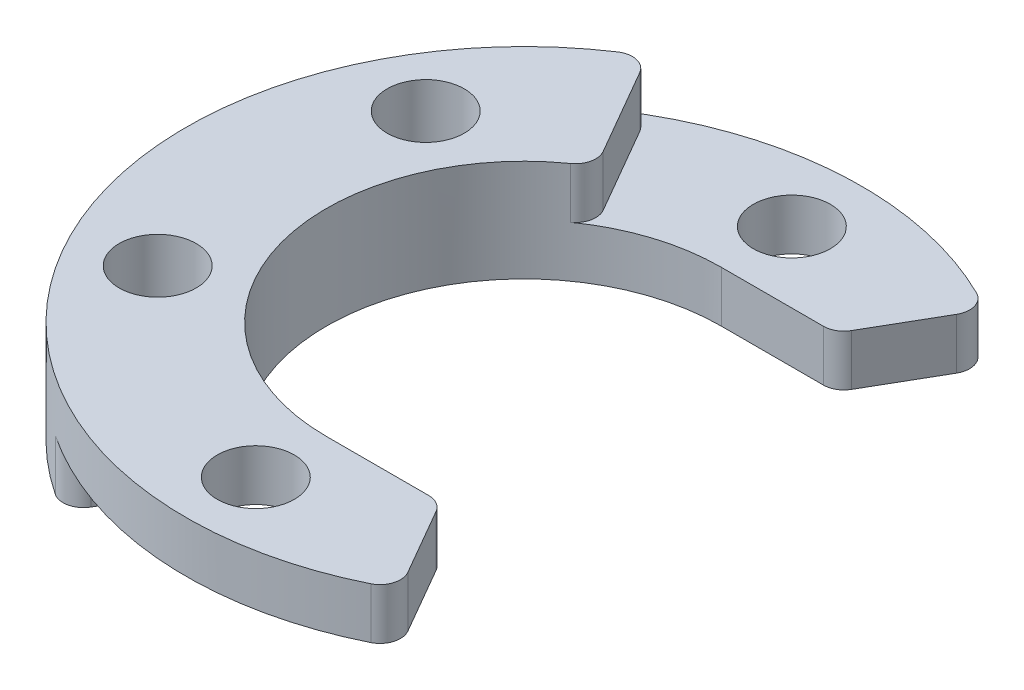
ISO-10303-21;
HEADER;
FILE_DESCRIPTION(('STEP AP214'),'2;1');
FILE_NAME('part.step','',(''),(''),'','','');
FILE_SCHEMA(('AUTOMOTIVE_DESIGN { 1 0 10303 214 1 1 1 1 }'));
ENDSEC;
DATA;
#1=APPLICATION_CONTEXT('core data for automotive mechanical design processes');
#2=APPLICATION_PROTOCOL_DEFINITION('international standard','automotive_design',2000,#1);
#3=PRODUCT_CONTEXT('',#1,'mechanical');
#4=PRODUCT('Part','Part','',(#3));
#5=PRODUCT_RELATED_PRODUCT_CATEGORY('part','',(#4));
#6=PRODUCT_DEFINITION_FORMATION('','',#4);
#7=PRODUCT_DEFINITION_CONTEXT('part definition',#1,'design');
#8=PRODUCT_DEFINITION('design','',#6,#7);
#9=PRODUCT_DEFINITION_SHAPE('','',#8);
#10=(LENGTH_UNIT() NAMED_UNIT(*) SI_UNIT(.MILLI.,.METRE.));
#11=(NAMED_UNIT(*) PLANE_ANGLE_UNIT() SI_UNIT($,.RADIAN.));
#12=(NAMED_UNIT(*) SI_UNIT($,.STERADIAN.) SOLID_ANGLE_UNIT());
#13=UNCERTAINTY_MEASURE_WITH_UNIT(LENGTH_MEASURE(1.E-05),#10,'distance_accuracy_value','');
#14=(GEOMETRIC_REPRESENTATION_CONTEXT(3) GLOBAL_UNCERTAINTY_ASSIGNED_CONTEXT((#13)) GLOBAL_UNIT_ASSIGNED_CONTEXT((#10,
#11,#12)) REPRESENTATION_CONTEXT('',''));
#15=CARTESIAN_POINT('',(0.,0.,0.));
#16=DIRECTION('',(0.,0.,1.));
#17=DIRECTION('',(1.,0.,0.));
#18=AXIS2_PLACEMENT_3D('',#15,#16,#17);
#19=CARTESIAN_POINT('',(0.,12.7,0.));
#20=DIRECTION('',(0.,-1.,0.));
#21=DIRECTION('',(0.,0.,-1.));
#22=AXIS2_PLACEMENT_3D('',#19,#20,#21);
#23=CYLINDRICAL_SURFACE('',#22,24.5992194732583);
#24=CARTESIAN_POINT('',(0.,6.35,0.));
#25=DIRECTION('',(0.,-1.,0.));
#26=DIRECTION('',(0.,0.,-1.));
#27=AXIS2_PLACEMENT_3D('',#24,#25,#26);
#28=CIRCLE('',#27,24.5992194732583);
#29=CARTESIAN_POINT('',(-14.2394537560617,6.35,-20.0589021489839));
#30=VERTEX_POINT('',#29);
#31=CARTESIAN_POINT('',(0.,6.35,-24.5992194732583));
#32=VERTEX_POINT('',#31);
#33=EDGE_CURVE('E204',#30,#32,#28,.T.);
#34=ORIENTED_EDGE('',*,*,#33,.F.);
#35=DIRECTION('',(0.,-1.,0.));
#36=VECTOR('',#35,1.);
#37=CARTESIAN_POINT('',(-14.2394537560617,12.7,-20.0589021489839));
#38=LINE('',#37,#36);
#39=CARTESIAN_POINT('',(-14.2394537560617,12.7,-20.0589021489839));
#40=VERTEX_POINT('',#39);
#41=EDGE_CURVE('E162',#30,#40,#38,.F.);
#42=ORIENTED_EDGE('',*,*,#41,.T.);
#43=CARTESIAN_POINT('',(0.,12.7,0.));
#44=DIRECTION('',(0.,1.,0.));
#45=DIRECTION('',(0.,0.,1.));
#46=AXIS2_PLACEMENT_3D('',#43,#44,#45);
#47=CIRCLE('',#46,24.5992194732583);
#48=CARTESIAN_POINT('',(0.,12.7,24.5992194732583));
#49=VERTEX_POINT('',#48);
#50=EDGE_CURVE('E156',#40,#49,#47,.T.);
#51=ORIENTED_EDGE('',*,*,#50,.T.);
#52=DIRECTION('',(0.,-1.,0.));
#53=VECTOR('',#52,1.);
#54=CARTESIAN_POINT('',(0.,12.7,24.5992194732583));
#55=LINE('',#54,#53);
#56=CARTESIAN_POINT('',(0.,6.35,24.5992194732583));
#57=VERTEX_POINT('',#56);
#58=EDGE_CURVE('E159',#49,#57,#55,.T.);
#59=ORIENTED_EDGE('',*,*,#58,.T.);
#60=CARTESIAN_POINT('',(0.,6.35,0.));
#61=DIRECTION('',(0.,1.,0.));
#62=DIRECTION('',(0.,0.,1.));
#63=AXIS2_PLACEMENT_3D('',#60,#61,#62);
#64=CIRCLE('',#63,24.5992194732583);
#65=CARTESIAN_POINT('',(-14.2394537560617,6.35,20.0589021489839));
#66=VERTEX_POINT('',#65);
#67=EDGE_CURVE('E191',#66,#57,#64,.T.);
#68=ORIENTED_EDGE('',*,*,#67,.F.);
#69=DIRECTION('',(0.,-1.,0.));
#70=VECTOR('',#69,1.);
#71=CARTESIAN_POINT('',(-14.2394537560617,12.7,20.0589021489839));
#72=LINE('',#71,#70);
#73=CARTESIAN_POINT('',(-14.2394537560617,0.,20.0589021489839));
#74=VERTEX_POINT('',#73);
#75=EDGE_CURVE('E305',#66,#74,#72,.T.);
#76=ORIENTED_EDGE('',*,*,#75,.T.);
#77=CARTESIAN_POINT('',(0.,0.,0.));
#78=DIRECTION('',(0.,1.,0.));
#79=DIRECTION('',(0.,0.,1.));
#80=AXIS2_PLACEMENT_3D('',#77,#78,#79);
#81=CIRCLE('',#80,24.5992194732583);
#82=CARTESIAN_POINT('',(0.,0.,-24.5992194732583));
#83=VERTEX_POINT('',#82);
#84=EDGE_CURVE('E166',#83,#74,#81,.T.);
#85=ORIENTED_EDGE('',*,*,#84,.F.);
#86=DIRECTION('',(0.,-1.,0.));
#87=VECTOR('',#86,1.);
#88=CARTESIAN_POINT('',(0.,12.7,-24.5992194732583));
#89=LINE('',#88,#87);
#90=EDGE_CURVE('E177',#32,#83,#89,.T.);
#91=ORIENTED_EDGE('',*,*,#90,.F.);
#92=EDGE_LOOP('',(#34,#42,#51,#59,#68,#76,#85,#91));
#93=FACE_BOUND('',#92,.T.);
#94=ADVANCED_FACE('F31',(#93),#23,.F.);
#95=CARTESIAN_POINT('',(0.,12.7,0.));
#96=DIRECTION('',(0.,1.,0.));
#97=DIRECTION('',(0.,0.,1.));
#98=AXIS2_PLACEMENT_3D('',#95,#96,#97);
#99=PLANE('',#98);
#100=DIRECTION('',(0.5,0.,0.866025403784439));
#101=VECTOR('',#100,1.);
#102=CARTESIAN_POINT('',(0.,12.7,0.));
#103=LINE('',#102,#101);
#104=CARTESIAN_POINT('',(-19.7374369319673,12.7,-34.1862435773538));
#105=VERTEX_POINT('',#104);
#106=CARTESIAN_POINT('',(-13.5100484234669,12.7,-23.4000902821605));
#107=VERTEX_POINT('',#106);
#108=EDGE_CURVE('E200',#105,#107,#103,.T.);
#109=ORIENTED_EDGE('',*,*,#108,.F.);
#110=CARTESIAN_POINT('',(-21.9371414575798,12.7,-32.9162435773538));
#111=DIRECTION('',(0.,1.,0.));
#112=DIRECTION('',(0.,0.,1.));
#113=AXIS2_PLACEMENT_3D('',#110,#111,#112);
#114=CIRCLE('',#113,2.54);
#115=CARTESIAN_POINT('',(-23.3457678293843,12.7,-35.0298593760876));
#116=VERTEX_POINT('',#115);
#117=EDGE_CURVE('E303',#105,#116,#114,.T.);
#118=ORIENTED_EDGE('',*,*,#117,.T.);
#119=CARTESIAN_POINT('',(0.,12.7,0.));
#120=DIRECTION('',(0.,1.,0.));
#121=DIRECTION('',(0.,0.,1.));
#122=AXIS2_PLACEMENT_3D('',#119,#120,#121);
#123=CIRCLE('',#122,42.0965072595339);
#124=CARTESIAN_POINT('',(18.6638641959963,12.7,37.732957699144));
#125=VERTEX_POINT('',#124);
#126=EDGE_CURVE('E241',#116,#125,#123,.T.);
#127=ORIENTED_EDGE('',*,*,#126,.T.);
#128=CARTESIAN_POINT('',(17.5377324063549,12.7,35.4562435773538));
#129=DIRECTION('',(0.,1.,0.));
#130=DIRECTION('',(0.,0.,1.));
#131=AXIS2_PLACEMENT_3D('',#128,#129,#130);
#132=CIRCLE('',#131,2.54);
#133=CARTESIAN_POINT('',(19.7374369319674,12.7,34.1862435773538));
#134=VERTEX_POINT('',#133);
#135=EDGE_CURVE('E281',#125,#134,#132,.T.);
#136=ORIENTED_EDGE('',*,*,#135,.T.);
#137=DIRECTION('',(0.500000000000001,0.,0.866025403784438));
#138=VECTOR('',#137,1.);
#139=CARTESIAN_POINT('',(29.4022070003563,12.7,50.9261163792742));
#140=LINE('',#139,#138);
#141=CARTESIAN_POINT('',(14.9356008266113,12.7,25.8692194732583));
#142=VERTEX_POINT('',#141);
#143=EDGE_CURVE('E215',#142,#134,#140,.T.);
#144=ORIENTED_EDGE('',*,*,#143,.F.);
#145=CARTESIAN_POINT('',(12.7358963009988,12.7,27.1392194732583));
#146=DIRECTION('',(0.,1.,0.));
#147=DIRECTION('',(0.,0.,1.));
#148=AXIS2_PLACEMENT_3D('',#145,#146,#147);
#149=CIRCLE('',#148,2.54);
#150=CARTESIAN_POINT('',(12.7358963009988,12.7,24.5992194732583));
#151=VERTEX_POINT('',#150);
#152=EDGE_CURVE('E174',#142,#151,#149,.T.);
#153=ORIENTED_EDGE('',*,*,#152,.T.);
#154=DIRECTION('',(-1.,0.,0.));
#155=VECTOR('',#154,1.);
#156=CARTESIAN_POINT('',(0.,12.7,24.5992194732583));
#157=LINE('',#156,#155);
#158=EDGE_CURVE('E169',#151,#49,#157,.T.);
#159=ORIENTED_EDGE('',*,*,#158,.T.);
#160=ORIENTED_EDGE('',*,*,#50,.F.);
#161=CARTESIAN_POINT('',(-15.7097529490794,12.7,-22.1300902821605));
#162=DIRECTION('',(0.,1.,0.));
#163=DIRECTION('',(0.,0.,1.));
#164=AXIS2_PLACEMENT_3D('',#161,#162,#163);
#165=CIRCLE('',#164,2.54);
#166=EDGE_CURVE('E301',#40,#107,#165,.T.);
#167=ORIENTED_EDGE('',*,*,#166,.T.);
#168=EDGE_LOOP('',(#109,#118,#127,#136,#144,#153,#159,#160,#167));
#169=FACE_BOUND('',#168,.T.);
#170=CARTESIAN_POINT('',(-28.9192671825416,12.7,16.6965466926067));
#171=DIRECTION('',(0.,1.,0.));
#172=DIRECTION('',(0.,0.,1.));
#173=AXIS2_PLACEMENT_3D('',#170,#171,#172);
#174=CIRCLE('',#173,4.80130432203246);
#175=CARTESIAN_POINT('',(-28.9192671825416,12.7,21.4978510146392));
#176=VERTEX_POINT('',#175);
#177=EDGE_CURVE('E228',#176,#176,#174,.T.);
#178=ORIENTED_EDGE('',*,*,#177,.F.);
#179=EDGE_LOOP('',(#178));
#180=FACE_BOUND('',#179,.T.);
#181=CARTESIAN_POINT('',(-2.33182859860893E-13,12.7,33.393093385214));
#182=DIRECTION('',(0.,1.,0.));
#183=DIRECTION('',(0.,0.,1.));
#184=AXIS2_PLACEMENT_3D('',#181,#182,#183);
#185=CIRCLE('',#184,4.80130432203246);
#186=CARTESIAN_POINT('',(-2.33182859860893E-13,12.7,38.1943977072465));
#187=VERTEX_POINT('',#186);
#188=EDGE_CURVE('E231',#187,#187,#185,.T.);
#189=ORIENTED_EDGE('',*,*,#188,.F.);
#190=EDGE_LOOP('',(#189));
#191=FACE_BOUND('',#190,.T.);
#192=CARTESIAN_POINT('',(-28.9192671825412,12.7,-16.6965466926073));
#193=DIRECTION('',(0.,1.,0.));
#194=DIRECTION('',(0.,0.,1.));
#195=AXIS2_PLACEMENT_3D('',#192,#193,#194);
#196=CIRCLE('',#195,4.80130432203246);
#197=CARTESIAN_POINT('',(-28.9192671825412,12.7,-11.8952423705749));
#198=VERTEX_POINT('',#197);
#199=EDGE_CURVE('E222',#198,#198,#196,.T.);
#200=ORIENTED_EDGE('',*,*,#199,.F.);
#201=EDGE_LOOP('',(#200));
#202=FACE_BOUND('',#201,.T.);
#203=ADVANCED_FACE('F171',(#169,#180,#191,#202),#99,.T.);
#204=CARTESIAN_POINT('',(0.,0.,0.));
#205=DIRECTION('',(0.,1.,0.));
#206=DIRECTION('',(0.,0.,1.));
#207=AXIS2_PLACEMENT_3D('',#204,#205,#206);
#208=PLANE('',#207);
#209=CARTESIAN_POINT('',(-28.9192671825416,0.,16.6965466926067));
#210=DIRECTION('',(0.,1.,0.));
#211=DIRECTION('',(0.,0.,1.));
#212=AXIS2_PLACEMENT_3D('',#209,#210,#211);
#213=CIRCLE('',#212,4.80130432203246);
#214=CARTESIAN_POINT('',(-28.9192671825416,0.,21.4978510146392));
#215=VERTEX_POINT('',#214);
#216=EDGE_CURVE('E225',#215,#215,#213,.T.);
#217=ORIENTED_EDGE('',*,*,#216,.T.);
#218=EDGE_LOOP('',(#217));
#219=FACE_BOUND('',#218,.T.);
#220=CARTESIAN_POINT('',(0.,0.,-33.393093385214));
#221=DIRECTION('',(0.,1.,0.));
#222=DIRECTION('',(0.,0.,1.));
#223=AXIS2_PLACEMENT_3D('',#220,#221,#222);
#224=CIRCLE('',#223,4.80130432203246);
#225=CARTESIAN_POINT('',(0.,0.,-28.5917890631816));
#226=VERTEX_POINT('',#225);
#227=EDGE_CURVE('E236',#226,#226,#224,.T.);
#228=ORIENTED_EDGE('',*,*,#227,.T.);
#229=EDGE_LOOP('',(#228));
#230=FACE_BOUND('',#229,.T.);
#231=ORIENTED_EDGE('',*,*,#84,.T.);
#232=CARTESIAN_POINT('',(-15.7097529490794,0.,22.1300902821605));
#233=DIRECTION('',(0.,1.,0.));
#234=DIRECTION('',(0.,0.,1.));
#235=AXIS2_PLACEMENT_3D('',#232,#233,#234);
#236=CIRCLE('',#235,2.54);
#237=CARTESIAN_POINT('',(-13.510048423467,0.,23.4000902821605));
#238=VERTEX_POINT('',#237);
#239=EDGE_CURVE('E314',#74,#238,#236,.F.);
#240=ORIENTED_EDGE('',*,*,#239,.T.);
#241=DIRECTION('',(0.500000000000001,0.,-0.866025403784438));
#242=VECTOR('',#241,1.);
#243=CARTESIAN_POINT('',(0.,0.,0.));
#244=LINE('',#243,#242);
#245=CARTESIAN_POINT('',(-19.7374369319674,0.,34.1862435773538));
#246=VERTEX_POINT('',#245);
#247=EDGE_CURVE('E183',#246,#238,#244,.T.);
#248=ORIENTED_EDGE('',*,*,#247,.F.);
#249=CARTESIAN_POINT('',(-21.9371414575799,0.,32.9162435773538));
#250=DIRECTION('',(0.,1.,0.));
#251=DIRECTION('',(0.,0.,1.));
#252=AXIS2_PLACEMENT_3D('',#249,#250,#251);
#253=CIRCLE('',#252,2.54);
#254=CARTESIAN_POINT('',(-23.3457678293843,0.,35.0298593760876));
#255=VERTEX_POINT('',#254);
#256=EDGE_CURVE('E312',#246,#255,#253,.F.);
#257=ORIENTED_EDGE('',*,*,#256,.T.);
#258=CARTESIAN_POINT('',(0.,0.,0.));
#259=DIRECTION('',(0.,1.,0.));
#260=DIRECTION('',(0.,0.,1.));
#261=AXIS2_PLACEMENT_3D('',#258,#259,#260);
#262=CIRCLE('',#261,42.0965072595339);
#263=CARTESIAN_POINT('',(18.6638641959963,0.,-37.732957699144));
#264=VERTEX_POINT('',#263);
#265=EDGE_CURVE('E165',#264,#255,#262,.T.);
#266=ORIENTED_EDGE('',*,*,#265,.F.);
#267=CARTESIAN_POINT('',(17.5377324063549,0.,-35.4562435773538));
#268=DIRECTION('',(0.,1.,0.));
#269=DIRECTION('',(0.,0.,1.));
#270=AXIS2_PLACEMENT_3D('',#267,#268,#269);
#271=CIRCLE('',#270,2.54);
#272=CARTESIAN_POINT('',(19.7374369319674,0.,-34.1862435773538));
#273=VERTEX_POINT('',#272);
#274=EDGE_CURVE('E263',#264,#273,#271,.F.);
#275=ORIENTED_EDGE('',*,*,#274,.T.);
#276=DIRECTION('',(-0.500000000000001,0.,0.866025403784438));
#277=VECTOR('',#276,1.);
#278=CARTESIAN_POINT('',(0.,0.,0.));
#279=LINE('',#278,#277);
#280=CARTESIAN_POINT('',(14.9356008266112,0.,-25.8692194732583));
#281=VERTEX_POINT('',#280);
#282=EDGE_CURVE('E216',#273,#281,#279,.T.);
#283=ORIENTED_EDGE('',*,*,#282,.T.);
#284=CARTESIAN_POINT('',(12.7358963009988,0.,-27.1392194732583));
#285=DIRECTION('',(0.,1.,0.));
#286=DIRECTION('',(0.,0.,1.));
#287=AXIS2_PLACEMENT_3D('',#284,#285,#286);
#288=CIRCLE('',#287,2.54);
#289=CARTESIAN_POINT('',(12.7358963009988,0.,-24.5992194732583));
#290=VERTEX_POINT('',#289);
#291=EDGE_CURVE('E261',#281,#290,#288,.F.);
#292=ORIENTED_EDGE('',*,*,#291,.T.);
#293=DIRECTION('',(1.,0.,0.));
#294=VECTOR('',#293,1.);
#295=CARTESIAN_POINT('',(0.,0.,-24.5992194732583));
#296=LINE('',#295,#294);
#297=EDGE_CURVE('E178',#83,#290,#296,.T.);
#298=ORIENTED_EDGE('',*,*,#297,.F.);
#299=EDGE_LOOP('',(#231,#240,#248,#257,#266,#275,#283,#292,#298));
#300=FACE_BOUND('',#299,.T.);
#301=CARTESIAN_POINT('',(-28.9192671825412,0.,-16.6965466926073));
#302=DIRECTION('',(0.,1.,0.));
#303=DIRECTION('',(0.,0.,1.));
#304=AXIS2_PLACEMENT_3D('',#301,#302,#303);
#305=CIRCLE('',#304,4.80130432203246);
#306=CARTESIAN_POINT('',(-28.9192671825412,0.,-11.8952423705749));
#307=VERTEX_POINT('',#306);
#308=EDGE_CURVE('E219',#307,#307,#305,.T.);
#309=ORIENTED_EDGE('',*,*,#308,.T.);
#310=EDGE_LOOP('',(#309));
#311=FACE_BOUND('',#310,.T.);
#312=ADVANCED_FACE('F327',(#219,#230,#300,#311),#208,.F.);
#313=CARTESIAN_POINT('',(0.,12.7,0.));
#314=DIRECTION('',(0.,-1.,0.));
#315=DIRECTION('',(0.,0.,-1.));
#316=AXIS2_PLACEMENT_3D('',#313,#314,#315);
#317=CYLINDRICAL_SURFACE('',#316,42.0965072595339);
#318=ORIENTED_EDGE('',*,*,#126,.F.);
#319=DIRECTION('',(0.,-1.,0.));
#320=VECTOR('',#319,1.);
#321=CARTESIAN_POINT('',(-23.3457678293843,12.7,-35.0298593760876));
#322=LINE('',#321,#320);
#323=CARTESIAN_POINT('',(-23.3457678293843,6.35,-35.0298593760876));
#324=VERTEX_POINT('',#323);
#325=EDGE_CURVE('E293',#116,#324,#322,.T.);
#326=ORIENTED_EDGE('',*,*,#325,.T.);
#327=CARTESIAN_POINT('',(0.,6.35,0.));
#328=DIRECTION('',(0.,-1.,0.));
#329=DIRECTION('',(0.,0.,-1.));
#330=AXIS2_PLACEMENT_3D('',#327,#328,#329);
#331=CIRCLE('',#330,42.0965072595339);
#332=CARTESIAN_POINT('',(18.6638641959963,6.35,-37.732957699144));
#333=VERTEX_POINT('',#332);
#334=EDGE_CURVE('E209',#324,#333,#331,.T.);
#335=ORIENTED_EDGE('',*,*,#334,.T.);
#336=DIRECTION('',(0.,-1.,0.));
#337=VECTOR('',#336,1.);
#338=CARTESIAN_POINT('',(18.6638641959963,12.7,-37.732957699144));
#339=LINE('',#338,#337);
#340=EDGE_CURVE('E258',#333,#264,#339,.T.);
#341=ORIENTED_EDGE('',*,*,#340,.T.);
#342=ORIENTED_EDGE('',*,*,#265,.T.);
#343=DIRECTION('',(0.,-1.,0.));
#344=VECTOR('',#343,1.);
#345=CARTESIAN_POINT('',(-23.3457678293843,12.7,35.0298593760876));
#346=LINE('',#345,#344);
#347=CARTESIAN_POINT('',(-23.3457678293843,6.35,35.0298593760876));
#348=VERTEX_POINT('',#347);
#349=EDGE_CURVE('E290',#255,#348,#346,.F.);
#350=ORIENTED_EDGE('',*,*,#349,.T.);
#351=CARTESIAN_POINT('',(0.,6.35,0.));
#352=DIRECTION('',(0.,1.,0.));
#353=DIRECTION('',(0.,0.,1.));
#354=AXIS2_PLACEMENT_3D('',#351,#352,#353);
#355=CIRCLE('',#354,42.0965072595339);
#356=CARTESIAN_POINT('',(18.6638641959963,6.35,37.732957699144));
#357=VERTEX_POINT('',#356);
#358=EDGE_CURVE('E194',#348,#357,#355,.T.);
#359=ORIENTED_EDGE('',*,*,#358,.T.);
#360=DIRECTION('',(0.,-1.,0.));
#361=VECTOR('',#360,1.);
#362=CARTESIAN_POINT('',(18.6638641959963,12.7,37.732957699144));
#363=LINE('',#362,#361);
#364=EDGE_CURVE('E255',#357,#125,#363,.F.);
#365=ORIENTED_EDGE('',*,*,#364,.T.);
#366=EDGE_LOOP('',(#318,#326,#335,#341,#342,#350,#359,#365));
#367=FACE_BOUND('',#366,.T.);
#368=ADVANCED_FACE('F352',(#367),#317,.T.);
#369=CARTESIAN_POINT('',(0.,12.7,-33.393093385214));
#370=DIRECTION('',(0.,-1.,0.));
#371=DIRECTION('',(0.,0.,-1.));
#372=AXIS2_PLACEMENT_3D('',#369,#370,#371);
#373=CYLINDRICAL_SURFACE('',#372,4.80130432203246);
#374=CARTESIAN_POINT('',(0.,6.35,-33.393093385214));
#375=DIRECTION('',(0.,-1.,0.));
#376=DIRECTION('',(0.,0.,-1.));
#377=AXIS2_PLACEMENT_3D('',#374,#375,#376);
#378=CIRCLE('',#377,4.80130432203246);
#379=CARTESIAN_POINT('',(0.,6.35,-38.1943977072465));
#380=VERTEX_POINT('',#379);
#381=EDGE_CURVE('E212',#380,#380,#378,.T.);
#382=ORIENTED_EDGE('',*,*,#381,.F.);
#383=EDGE_LOOP('',(#382));
#384=FACE_BOUND('',#383,.T.);
#385=ORIENTED_EDGE('',*,*,#227,.F.);
#386=EDGE_LOOP('',(#385));
#387=FACE_BOUND('',#386,.T.);
#388=ADVANCED_FACE('F395',(#384,#387),#373,.F.);
#389=CARTESIAN_POINT('',(-2.33182859860893E-13,12.7,33.393093385214));
#390=DIRECTION('',(0.,-1.,0.));
#391=DIRECTION('',(0.,0.,-1.));
#392=AXIS2_PLACEMENT_3D('',#389,#390,#391);
#393=CYLINDRICAL_SURFACE('',#392,4.80130432203246);
#394=CARTESIAN_POINT('',(-2.33182859860893E-13,6.35,33.393093385214));
#395=DIRECTION('',(0.,1.,0.));
#396=DIRECTION('',(0.,0.,1.));
#397=AXIS2_PLACEMENT_3D('',#394,#395,#396);
#398=CIRCLE('',#397,4.80130432203246);
#399=CARTESIAN_POINT('',(-2.33182859860893E-13,6.35,38.1943977072465));
#400=VERTEX_POINT('',#399);
#401=EDGE_CURVE('E197',#400,#400,#398,.T.);
#402=ORIENTED_EDGE('',*,*,#401,.F.);
#403=EDGE_LOOP('',(#402));
#404=FACE_BOUND('',#403,.T.);
#405=ORIENTED_EDGE('',*,*,#188,.T.);
#406=EDGE_LOOP('',(#405));
#407=FACE_BOUND('',#406,.T.);
#408=ADVANCED_FACE('F552',(#404,#407),#393,.F.);
#409=CARTESIAN_POINT('',(-28.9192671825416,12.7,16.6965466926067));
#410=DIRECTION('',(0.,-1.,0.));
#411=DIRECTION('',(0.,0.,-1.));
#412=AXIS2_PLACEMENT_3D('',#409,#410,#411);
#413=CYLINDRICAL_SURFACE('',#412,4.80130432203246);
#414=ORIENTED_EDGE('',*,*,#177,.T.);
#415=EDGE_LOOP('',(#414));
#416=FACE_BOUND('',#415,.T.);
#417=ORIENTED_EDGE('',*,*,#216,.F.);
#418=EDGE_LOOP('',(#417));
#419=FACE_BOUND('',#418,.T.);
#420=ADVANCED_FACE('F557',(#416,#419),#413,.F.);
#421=CARTESIAN_POINT('',(-28.9192671825412,12.7,-16.6965466926073));
#422=DIRECTION('',(0.,-1.,0.));
#423=DIRECTION('',(0.,0.,-1.));
#424=AXIS2_PLACEMENT_3D('',#421,#422,#423);
#425=CYLINDRICAL_SURFACE('',#424,4.80130432203246);
#426=ORIENTED_EDGE('',*,*,#199,.T.);
#427=EDGE_LOOP('',(#426));
#428=FACE_BOUND('',#427,.T.);
#429=ORIENTED_EDGE('',*,*,#308,.F.);
#430=EDGE_LOOP('',(#429));
#431=FACE_BOUND('',#430,.T.);
#432=ADVANCED_FACE('F545',(#428,#431),#425,.F.);
#433=CARTESIAN_POINT('',(0.,0.,0.));
#434=DIRECTION('',(-0.866025403784438,0.,-0.500000000000001));
#435=DIRECTION('',(-0.500000000000001,0.,0.866025403784438));
#436=AXIS2_PLACEMENT_3D('',#433,#434,#435);
#437=PLANE('',#436);
#438=ORIENTED_EDGE('',*,*,#282,.F.);
#439=DIRECTION('',(0.,-1.,0.));
#440=VECTOR('',#439,1.);
#441=CARTESIAN_POINT('',(19.7374369319674,0.,-34.1862435773538));
#442=LINE('',#441,#440);
#443=CARTESIAN_POINT('',(19.7374369319674,6.35,-34.1862435773538));
#444=VERTEX_POINT('',#443);
#445=EDGE_CURVE('E268',#273,#444,#442,.F.);
#446=ORIENTED_EDGE('',*,*,#445,.T.);
#447=DIRECTION('',(-0.500000000000001,0.,0.866025403784438));
#448=VECTOR('',#447,1.);
#449=CARTESIAN_POINT('',(0.,6.35,0.));
#450=LINE('',#449,#448);
#451=CARTESIAN_POINT('',(14.9356008266112,6.35,-25.8692194732583));
#452=VERTEX_POINT('',#451);
#453=EDGE_CURVE('E243',#444,#452,#450,.T.);
#454=ORIENTED_EDGE('',*,*,#453,.T.);
#455=DIRECTION('',(0.,-1.,0.));
#456=VECTOR('',#455,1.);
#457=CARTESIAN_POINT('',(14.9356008266112,0.,-25.8692194732583));
#458=LINE('',#457,#456);
#459=EDGE_CURVE('E265',#452,#281,#458,.T.);
#460=ORIENTED_EDGE('',*,*,#459,.T.);
#461=EDGE_LOOP('',(#438,#446,#454,#460));
#462=FACE_BOUND('',#461,.T.);
#463=ADVANCED_FACE('F344',(#462),#437,.F.);
#464=CARTESIAN_POINT('',(29.4022070003563,0.,50.9261163792742));
#465=DIRECTION('',(-0.866025403784438,0.,0.500000000000001));
#466=DIRECTION('',(0.500000000000001,0.,0.866025403784438));
#467=AXIS2_PLACEMENT_3D('',#464,#465,#466);
#468=PLANE('',#467);
#469=DIRECTION('',(-0.500000000000001,0.,-0.866025403784438));
#470=VECTOR('',#469,1.);
#471=CARTESIAN_POINT('',(29.4022070003563,6.35,50.9261163792742));
#472=LINE('',#471,#470);
#473=CARTESIAN_POINT('',(19.7374369319674,6.35,34.1862435773538));
#474=VERTEX_POINT('',#473);
#475=CARTESIAN_POINT('',(14.9356008266113,6.35,25.8692194732583));
#476=VERTEX_POINT('',#475);
#477=EDGE_CURVE('E248',#474,#476,#472,.T.);
#478=ORIENTED_EDGE('',*,*,#477,.T.);
#479=DIRECTION('',(0.,1.,0.));
#480=VECTOR('',#479,1.);
#481=CARTESIAN_POINT('',(14.9356008266113,0.,25.8692194732583));
#482=LINE('',#481,#480);
#483=EDGE_CURVE('E278',#476,#142,#482,.T.);
#484=ORIENTED_EDGE('',*,*,#483,.T.);
#485=ORIENTED_EDGE('',*,*,#143,.T.);
#486=DIRECTION('',(0.,-1.,0.));
#487=VECTOR('',#486,1.);
#488=CARTESIAN_POINT('',(19.7374369319674,0.,34.1862435773538));
#489=LINE('',#488,#487);
#490=EDGE_CURVE('E276',#134,#474,#489,.T.);
#491=ORIENTED_EDGE('',*,*,#490,.T.);
#492=EDGE_LOOP('',(#478,#484,#485,#491));
#493=FACE_BOUND('',#492,.T.);
#494=ADVANCED_FACE('F466',(#493),#468,.F.);
#495=CARTESIAN_POINT('',(0.,6.35,0.));
#496=DIRECTION('',(-0.866025403784439,0.,0.5));
#497=DIRECTION('',(0.5,0.,0.866025403784439));
#498=AXIS2_PLACEMENT_3D('',#495,#496,#497);
#499=PLANE('',#498);
#500=DIRECTION('',(0.5,0.,0.866025403784439));
#501=VECTOR('',#500,1.);
#502=CARTESIAN_POINT('',(0.,6.35,0.));
#503=LINE('',#502,#501);
#504=CARTESIAN_POINT('',(-19.7374369319673,6.35,-34.1862435773538));
#505=VERTEX_POINT('',#504);
#506=CARTESIAN_POINT('',(-13.5100484234669,6.35,-23.4000902821605));
#507=VERTEX_POINT('',#506);
#508=EDGE_CURVE('E201',#505,#507,#503,.T.);
#509=ORIENTED_EDGE('',*,*,#508,.F.);
#510=DIRECTION('',(0.,-1.,0.));
#511=VECTOR('',#510,1.);
#512=CARTESIAN_POINT('',(-19.7374369319674,6.35,-34.1862435773538));
#513=LINE('',#512,#511);
#514=EDGE_CURVE('E299',#505,#105,#513,.F.);
#515=ORIENTED_EDGE('',*,*,#514,.T.);
#516=ORIENTED_EDGE('',*,*,#108,.T.);
#517=DIRECTION('',(0.,1.,0.));
#518=VECTOR('',#517,1.);
#519=CARTESIAN_POINT('',(-13.5100484234669,6.35,-23.4000902821605));
#520=LINE('',#519,#518);
#521=EDGE_CURVE('E296',#107,#507,#520,.F.);
#522=ORIENTED_EDGE('',*,*,#521,.T.);
#523=EDGE_LOOP('',(#509,#515,#516,#522));
#524=FACE_BOUND('',#523,.T.);
#525=ADVANCED_FACE('F361',(#524),#499,.F.);
#526=CARTESIAN_POINT('',(0.,6.35,0.));
#527=DIRECTION('',(0.,-1.,0.));
#528=DIRECTION('',(0.,0.,-1.));
#529=AXIS2_PLACEMENT_3D('',#526,#527,#528);
#530=PLANE('',#529);
#531=ORIENTED_EDGE('',*,*,#381,.T.);
#532=EDGE_LOOP('',(#531));
#533=FACE_BOUND('',#532,.T.);
#534=ORIENTED_EDGE('',*,*,#453,.F.);
#535=CARTESIAN_POINT('',(17.5377324063549,6.35,-35.4562435773538));
#536=DIRECTION('',(0.,-1.,0.));
#537=DIRECTION('',(0.,0.,-1.));
#538=AXIS2_PLACEMENT_3D('',#535,#536,#537);
#539=CIRCLE('',#538,2.54);
#540=EDGE_CURVE('E272',#444,#333,#539,.F.);
#541=ORIENTED_EDGE('',*,*,#540,.T.);
#542=ORIENTED_EDGE('',*,*,#334,.F.);
#543=CARTESIAN_POINT('',(-21.9371414575798,6.35,-32.9162435773538));
#544=DIRECTION('',(0.,-1.,0.));
#545=DIRECTION('',(0.,0.,-1.));
#546=AXIS2_PLACEMENT_3D('',#543,#544,#545);
#547=CIRCLE('',#546,2.54);
#548=EDGE_CURVE('E316',#324,#505,#547,.T.);
#549=ORIENTED_EDGE('',*,*,#548,.T.);
#550=ORIENTED_EDGE('',*,*,#508,.T.);
#551=CARTESIAN_POINT('',(-15.7097529490794,6.35,-22.1300902821605));
#552=DIRECTION('',(0.,-1.,0.));
#553=DIRECTION('',(0.,0.,-1.));
#554=AXIS2_PLACEMENT_3D('',#551,#552,#553);
#555=CIRCLE('',#554,2.54);
#556=EDGE_CURVE('E318',#507,#30,#555,.T.);
#557=ORIENTED_EDGE('',*,*,#556,.T.);
#558=ORIENTED_EDGE('',*,*,#33,.T.);
#559=DIRECTION('',(1.,0.,0.));
#560=VECTOR('',#559,1.);
#561=CARTESIAN_POINT('',(0.,6.35,-24.5992194732583));
#562=LINE('',#561,#560);
#563=CARTESIAN_POINT('',(12.7358963009988,6.35,-24.5992194732583));
#564=VERTEX_POINT('',#563);
#565=EDGE_CURVE('E252',#32,#564,#562,.T.);
#566=ORIENTED_EDGE('',*,*,#565,.T.);
#567=CARTESIAN_POINT('',(12.7358963009988,6.35,-27.1392194732583));
#568=DIRECTION('',(0.,-1.,0.));
#569=DIRECTION('',(0.,0.,-1.));
#570=AXIS2_PLACEMENT_3D('',#567,#568,#569);
#571=CIRCLE('',#570,2.54);
#572=EDGE_CURVE('E270',#564,#452,#571,.F.);
#573=ORIENTED_EDGE('',*,*,#572,.T.);
#574=EDGE_LOOP('',(#534,#541,#542,#549,#550,#557,#558,#566,#573));
#575=FACE_BOUND('',#574,.T.);
#576=ADVANCED_FACE('F340',(#533,#575),#530,.F.);
#577=CARTESIAN_POINT('',(0.,6.35,0.));
#578=DIRECTION('',(-0.866025403784438,0.,-0.500000000000001));
#579=DIRECTION('',(-0.500000000000001,0.,0.866025403784438));
#580=AXIS2_PLACEMENT_3D('',#577,#578,#579);
#581=PLANE('',#580);
#582=ORIENTED_EDGE('',*,*,#247,.T.);
#583=DIRECTION('',(0.,1.,0.));
#584=VECTOR('',#583,1.);
#585=CARTESIAN_POINT('',(-13.510048423467,6.35,23.4000902821605));
#586=LINE('',#585,#584);
#587=CARTESIAN_POINT('',(-13.510048423467,6.35,23.4000902821605));
#588=VERTEX_POINT('',#587);
#589=EDGE_CURVE('E310',#238,#588,#586,.T.);
#590=ORIENTED_EDGE('',*,*,#589,.T.);
#591=DIRECTION('',(0.500000000000001,0.,-0.866025403784438));
#592=VECTOR('',#591,1.);
#593=CARTESIAN_POINT('',(0.,6.35,0.));
#594=LINE('',#593,#592);
#595=CARTESIAN_POINT('',(-19.7374369319674,6.35,34.1862435773538));
#596=VERTEX_POINT('',#595);
#597=EDGE_CURVE('E186',#596,#588,#594,.T.);
#598=ORIENTED_EDGE('',*,*,#597,.F.);
#599=DIRECTION('',(0.,-1.,0.));
#600=VECTOR('',#599,1.);
#601=CARTESIAN_POINT('',(-19.7374369319674,6.35,34.1862435773538));
#602=LINE('',#601,#600);
#603=EDGE_CURVE('E308',#596,#246,#602,.T.);
#604=ORIENTED_EDGE('',*,*,#603,.T.);
#605=EDGE_LOOP('',(#582,#590,#598,#604));
#606=FACE_BOUND('',#605,.T.);
#607=ADVANCED_FACE('F377',(#606),#581,.F.);
#608=CARTESIAN_POINT('',(26.7480682726386,6.35,5.1638138085721));
#609=DIRECTION('',(0.,1.,0.));
#610=DIRECTION('',(0.,0.,1.));
#611=AXIS2_PLACEMENT_3D('',#608,#609,#610);
#612=PLANE('',#611);
#613=ORIENTED_EDGE('',*,*,#401,.T.);
#614=EDGE_LOOP('',(#613));
#615=FACE_BOUND('',#614,.T.);
#616=DIRECTION('',(1.,0.,0.));
#617=VECTOR('',#616,1.);
#618=CARTESIAN_POINT('',(26.7480682726386,6.35,24.5992194732583));
#619=LINE('',#618,#617);
#620=CARTESIAN_POINT('',(12.7358963009988,6.35,24.5992194732583));
#621=VERTEX_POINT('',#620);
#622=EDGE_CURVE('E182',#57,#621,#619,.T.);
#623=ORIENTED_EDGE('',*,*,#622,.T.);
#624=CARTESIAN_POINT('',(12.7358963009988,6.35,27.1392194732583));
#625=DIRECTION('',(0.,1.,0.));
#626=DIRECTION('',(0.,0.,1.));
#627=AXIS2_PLACEMENT_3D('',#624,#625,#626);
#628=CIRCLE('',#627,2.54);
#629=EDGE_CURVE('E288',#621,#476,#628,.F.);
#630=ORIENTED_EDGE('',*,*,#629,.T.);
#631=ORIENTED_EDGE('',*,*,#477,.F.);
#632=CARTESIAN_POINT('',(17.5377324063549,6.35,35.4562435773538));
#633=DIRECTION('',(0.,1.,0.));
#634=DIRECTION('',(0.,0.,1.));
#635=AXIS2_PLACEMENT_3D('',#632,#633,#634);
#636=CIRCLE('',#635,2.54);
#637=EDGE_CURVE('E286',#474,#357,#636,.F.);
#638=ORIENTED_EDGE('',*,*,#637,.T.);
#639=ORIENTED_EDGE('',*,*,#358,.F.);
#640=CARTESIAN_POINT('',(-21.9371414575799,6.35,32.9162435773538));
#641=DIRECTION('',(0.,1.,0.));
#642=DIRECTION('',(0.,0.,1.));
#643=AXIS2_PLACEMENT_3D('',#640,#641,#642);
#644=CIRCLE('',#643,2.54);
#645=EDGE_CURVE('E11',#348,#596,#644,.T.);
#646=ORIENTED_EDGE('',*,*,#645,.T.);
#647=ORIENTED_EDGE('',*,*,#597,.T.);
#648=CARTESIAN_POINT('',(-15.7097529490794,6.35,22.1300902821605));
#649=DIRECTION('',(0.,1.,0.));
#650=DIRECTION('',(0.,0.,1.));
#651=AXIS2_PLACEMENT_3D('',#648,#649,#650);
#652=CIRCLE('',#651,2.54);
#653=EDGE_CURVE('E39',#588,#66,#652,.T.);
#654=ORIENTED_EDGE('',*,*,#653,.T.);
#655=ORIENTED_EDGE('',*,*,#67,.T.);
#656=EDGE_LOOP('',(#623,#630,#631,#638,#639,#646,#647,#654,#655));
#657=FACE_BOUND('',#656,.T.);
#658=ADVANCED_FACE('F320',(#615,#657),#612,.F.);
#659=CARTESIAN_POINT('',(0.,12.7,24.5992194732583));
#660=DIRECTION('',(0.,0.,1.));
#661=DIRECTION('',(1.,0.,0.));
#662=AXIS2_PLACEMENT_3D('',#659,#660,#661);
#663=PLANE('',#662);
#664=ORIENTED_EDGE('',*,*,#158,.F.);
#665=DIRECTION('',(0.,1.,0.));
#666=VECTOR('',#665,1.);
#667=CARTESIAN_POINT('',(12.7358963009988,12.7,24.5992194732583));
#668=LINE('',#667,#666);
#669=EDGE_CURVE('E284',#151,#621,#668,.F.);
#670=ORIENTED_EDGE('',*,*,#669,.T.);
#671=ORIENTED_EDGE('',*,*,#622,.F.);
#672=ORIENTED_EDGE('',*,*,#58,.F.);
#673=EDGE_LOOP('',(#664,#670,#671,#672));
#674=FACE_BOUND('',#673,.T.);
#675=ADVANCED_FACE('F180',(#674),#663,.F.);
#676=CARTESIAN_POINT('',(0.,12.7,-24.5992194732583));
#677=DIRECTION('',(0.,0.,-1.));
#678=DIRECTION('',(-1.,0.,0.));
#679=AXIS2_PLACEMENT_3D('',#676,#677,#678);
#680=PLANE('',#679);
#681=ORIENTED_EDGE('',*,*,#297,.T.);
#682=DIRECTION('',(0.,-1.,0.));
#683=VECTOR('',#682,1.);
#684=CARTESIAN_POINT('',(12.7358963009988,12.7,-24.5992194732583));
#685=LINE('',#684,#683);
#686=EDGE_CURVE('E274',#290,#564,#685,.F.);
#687=ORIENTED_EDGE('',*,*,#686,.T.);
#688=ORIENTED_EDGE('',*,*,#565,.F.);
#689=ORIENTED_EDGE('',*,*,#90,.T.);
#690=EDGE_LOOP('',(#681,#687,#688,#689));
#691=FACE_BOUND('',#690,.T.);
#692=ADVANCED_FACE('F333',(#691),#680,.F.);
#693=CARTESIAN_POINT('',(17.5377324063549,12.7,-35.4562435773538));
#694=DIRECTION('',(0.,-1.,0.));
#695=DIRECTION('',(0.,0.,-1.));
#696=AXIS2_PLACEMENT_3D('',#693,#694,#695);
#697=CYLINDRICAL_SURFACE('',#696,2.54);
#698=ORIENTED_EDGE('',*,*,#540,.F.);
#699=ORIENTED_EDGE('',*,*,#445,.F.);
#700=ORIENTED_EDGE('',*,*,#274,.F.);
#701=ORIENTED_EDGE('',*,*,#340,.F.);
#702=EDGE_LOOP('',(#698,#699,#700,#701));
#703=FACE_BOUND('',#702,.T.);
#704=ADVANCED_FACE('F347',(#703),#697,.T.);
#705=CARTESIAN_POINT('',(12.7358963009988,0.,-27.1392194732583));
#706=DIRECTION('',(0.,-1.,0.));
#707=DIRECTION('',(0.,0.,-1.));
#708=AXIS2_PLACEMENT_3D('',#705,#706,#707);
#709=CYLINDRICAL_SURFACE('',#708,2.54);
#710=ORIENTED_EDGE('',*,*,#572,.F.);
#711=ORIENTED_EDGE('',*,*,#686,.F.);
#712=ORIENTED_EDGE('',*,*,#291,.F.);
#713=ORIENTED_EDGE('',*,*,#459,.F.);
#714=EDGE_LOOP('',(#710,#711,#712,#713));
#715=FACE_BOUND('',#714,.T.);
#716=ADVANCED_FACE('F336',(#715),#709,.T.);
#717=CARTESIAN_POINT('',(12.7358963009988,0.,27.1392194732583));
#718=DIRECTION('',(0.,1.,0.));
#719=DIRECTION('',(0.,0.,1.));
#720=AXIS2_PLACEMENT_3D('',#717,#718,#719);
#721=CYLINDRICAL_SURFACE('',#720,2.54);
#722=ORIENTED_EDGE('',*,*,#629,.F.);
#723=ORIENTED_EDGE('',*,*,#669,.F.);
#724=ORIENTED_EDGE('',*,*,#152,.F.);
#725=ORIENTED_EDGE('',*,*,#483,.F.);
#726=EDGE_LOOP('',(#722,#723,#724,#725));
#727=FACE_BOUND('',#726,.T.);
#728=ADVANCED_FACE('F407',(#727),#721,.T.);
#729=CARTESIAN_POINT('',(17.5377324063549,12.7,35.4562435773538));
#730=DIRECTION('',(0.,-1.,0.));
#731=DIRECTION('',(0.,0.,-1.));
#732=AXIS2_PLACEMENT_3D('',#729,#730,#731);
#733=CYLINDRICAL_SURFACE('',#732,2.54);
#734=ORIENTED_EDGE('',*,*,#637,.F.);
#735=ORIENTED_EDGE('',*,*,#490,.F.);
#736=ORIENTED_EDGE('',*,*,#135,.F.);
#737=ORIENTED_EDGE('',*,*,#364,.F.);
#738=EDGE_LOOP('',(#734,#735,#736,#737));
#739=FACE_BOUND('',#738,.T.);
#740=ADVANCED_FACE('F370',(#739),#733,.T.);
#741=CARTESIAN_POINT('',(-21.9371414575798,12.7,-32.9162435773538));
#742=DIRECTION('',(0.,-1.,0.));
#743=DIRECTION('',(0.,0.,-1.));
#744=AXIS2_PLACEMENT_3D('',#741,#742,#743);
#745=CYLINDRICAL_SURFACE('',#744,2.54);
#746=ORIENTED_EDGE('',*,*,#117,.F.);
#747=ORIENTED_EDGE('',*,*,#514,.F.);
#748=ORIENTED_EDGE('',*,*,#548,.F.);
#749=ORIENTED_EDGE('',*,*,#325,.F.);
#750=EDGE_LOOP('',(#746,#747,#748,#749));
#751=FACE_BOUND('',#750,.T.);
#752=ADVANCED_FACE('F357',(#751),#745,.T.);
#753=CARTESIAN_POINT('',(-15.7097529490794,12.7,-22.1300902821605));
#754=DIRECTION('',(0.,-1.,0.));
#755=DIRECTION('',(0.,0.,-1.));
#756=AXIS2_PLACEMENT_3D('',#753,#754,#755);
#757=CYLINDRICAL_SURFACE('',#756,2.54);
#758=ORIENTED_EDGE('',*,*,#166,.F.);
#759=ORIENTED_EDGE('',*,*,#41,.F.);
#760=ORIENTED_EDGE('',*,*,#556,.F.);
#761=ORIENTED_EDGE('',*,*,#521,.F.);
#762=EDGE_LOOP('',(#758,#759,#760,#761));
#763=FACE_BOUND('',#762,.T.);
#764=ADVANCED_FACE('F364',(#763),#757,.T.);
#765=CARTESIAN_POINT('',(-15.7097529490794,12.7,22.1300902821605));
#766=DIRECTION('',(0.,-1.,0.));
#767=DIRECTION('',(0.,0.,-1.));
#768=AXIS2_PLACEMENT_3D('',#765,#766,#767);
#769=CYLINDRICAL_SURFACE('',#768,2.54);
#770=ORIENTED_EDGE('',*,*,#239,.F.);
#771=ORIENTED_EDGE('',*,*,#75,.F.);
#772=ORIENTED_EDGE('',*,*,#653,.F.);
#773=ORIENTED_EDGE('',*,*,#589,.F.);
#774=EDGE_LOOP('',(#770,#771,#772,#773));
#775=FACE_BOUND('',#774,.T.);
#776=ADVANCED_FACE('F322',(#775),#769,.T.);
#777=CARTESIAN_POINT('',(-21.9371414575799,12.7,32.9162435773538));
#778=DIRECTION('',(0.,-1.,0.));
#779=DIRECTION('',(0.,0.,-1.));
#780=AXIS2_PLACEMENT_3D('',#777,#778,#779);
#781=CYLINDRICAL_SURFACE('',#780,2.54);
#782=ORIENTED_EDGE('',*,*,#256,.F.);
#783=ORIENTED_EDGE('',*,*,#603,.F.);
#784=ORIENTED_EDGE('',*,*,#645,.F.);
#785=ORIENTED_EDGE('',*,*,#349,.F.);
#786=EDGE_LOOP('',(#782,#783,#784,#785));
#787=FACE_BOUND('',#786,.T.);
#788=ADVANCED_FACE('F33',(#787),#781,.T.);
#789=CLOSED_SHELL('',(#94,#203,#312,#368,#388,#408,#420,#432,#463,#494,#525,#576,#607,#658,#675,
#692,#704,#716,#728,#740,#752,#764,#776,#788));
#790=MANIFOLD_SOLID_BREP('B2',#789);
#791=ADVANCED_BREP_SHAPE_REPRESENTATION('',(#18,#790),#14);
#792=SHAPE_DEFINITION_REPRESENTATION(#9,#791);
ENDSEC;
END-ISO-10303-21;
